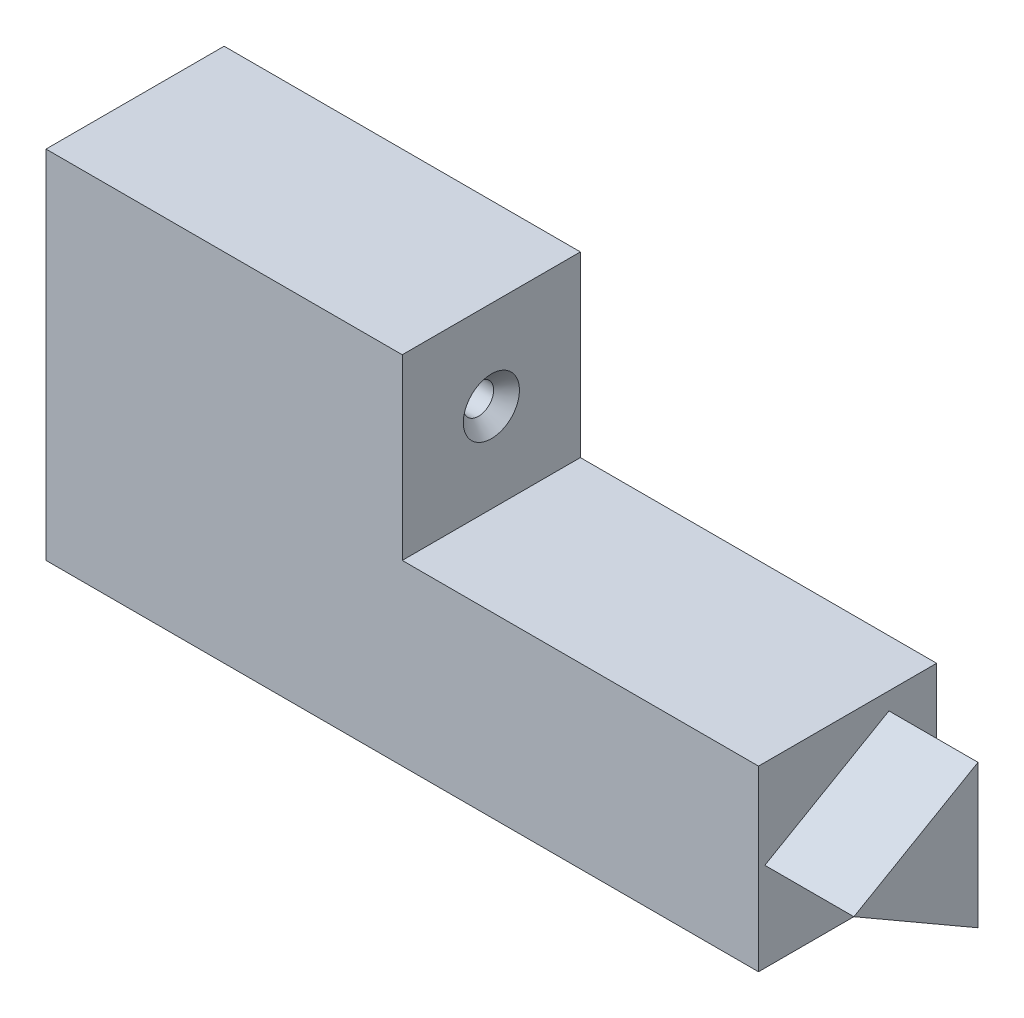
ISO-10303-21;
HEADER;
FILE_DESCRIPTION(('STEP AP214'),'2;1');
FILE_NAME('part.step','',(''),(''),'','','');
FILE_SCHEMA(('AUTOMOTIVE_DESIGN { 1 0 10303 214 1 1 1 1 }'));
ENDSEC;
DATA;
#1=APPLICATION_CONTEXT('core data for automotive mechanical design processes');
#2=APPLICATION_PROTOCOL_DEFINITION('international standard','automotive_design',2000,#1);
#3=PRODUCT_CONTEXT('',#1,'mechanical');
#4=PRODUCT('Part','Part','',(#3));
#5=PRODUCT_RELATED_PRODUCT_CATEGORY('part','',(#4));
#6=PRODUCT_DEFINITION_FORMATION('','',#4);
#7=PRODUCT_DEFINITION_CONTEXT('part definition',#1,'design');
#8=PRODUCT_DEFINITION('design','',#6,#7);
#9=PRODUCT_DEFINITION_SHAPE('','',#8);
#10=(LENGTH_UNIT() NAMED_UNIT(*) SI_UNIT(.MILLI.,.METRE.));
#11=(NAMED_UNIT(*) PLANE_ANGLE_UNIT() SI_UNIT($,.RADIAN.));
#12=(NAMED_UNIT(*) SI_UNIT($,.STERADIAN.) SOLID_ANGLE_UNIT());
#13=UNCERTAINTY_MEASURE_WITH_UNIT(LENGTH_MEASURE(1.E-05),#10,'distance_accuracy_value','');
#14=(GEOMETRIC_REPRESENTATION_CONTEXT(3) GLOBAL_UNCERTAINTY_ASSIGNED_CONTEXT((#13)) GLOBAL_UNIT_ASSIGNED_CONTEXT((#10,
#11,#12)) REPRESENTATION_CONTEXT('',''));
#15=CARTESIAN_POINT('',(0.,0.,0.));
#16=DIRECTION('',(0.,0.,1.));
#17=DIRECTION('',(1.,0.,0.));
#18=AXIS2_PLACEMENT_3D('',#15,#16,#17);
#19=CARTESIAN_POINT('',(80.,0.,0.));
#20=DIRECTION('',(-1.,0.,0.));
#21=DIRECTION('',(0.,0.,1.));
#22=AXIS2_PLACEMENT_3D('',#19,#20,#21);
#23=PLANE('',#22);
#24=DIRECTION('',(0.,-1.,0.));
#25=VECTOR('',#24,1.);
#26=CARTESIAN_POINT('',(80.,-17.6390114822675,37.7241266195551));
#27=LINE('',#26,#25);
#28=CARTESIAN_POINT('',(80.,2.36098851773249,37.7241266195551));
#29=VERTEX_POINT('',#28);
#30=CARTESIAN_POINT('',(80.,-17.6390114822675,37.7241266195551));
#31=VERTEX_POINT('',#30);
#32=EDGE_CURVE('E139',#29,#31,#27,.T.);
#33=ORIENTED_EDGE('',*,*,#32,.T.);
#34=DIRECTION('',(0.,0.,-1.));
#35=VECTOR('',#34,1.);
#36=CARTESIAN_POINT('',(80.,-17.6390114822675,37.7241266195551));
#37=LINE('',#36,#35);
#38=CARTESIAN_POINT('',(80.,-17.6390114822675,17.7241266195551));
#39=VERTEX_POINT('',#38);
#40=EDGE_CURVE('E142',#31,#39,#37,.T.);
#41=ORIENTED_EDGE('',*,*,#40,.T.);
#42=DIRECTION('',(0.,1.,0.));
#43=VECTOR('',#42,1.);
#44=CARTESIAN_POINT('',(80.,-17.6390114822675,17.7241266195551));
#45=LINE('',#44,#43);
#46=CARTESIAN_POINT('',(80.,2.36098851773249,17.7241266195551));
#47=VERTEX_POINT('',#46);
#48=EDGE_CURVE('E145',#39,#47,#45,.T.);
#49=ORIENTED_EDGE('',*,*,#48,.T.);
#50=DIRECTION('',(0.,0.,1.));
#51=VECTOR('',#50,1.);
#52=CARTESIAN_POINT('',(80.,2.36098851773249,37.7241266195551));
#53=LINE('',#52,#51);
#54=EDGE_CURVE('E147',#47,#29,#53,.T.);
#55=ORIENTED_EDGE('',*,*,#54,.T.);
#56=EDGE_LOOP('',(#33,#41,#49,#55));
#57=FACE_BOUND('',#56,.T.);
#58=DIRECTION('',(0.,-0.500000000000004,0.866025403784436));
#59=VECTOR('',#58,1.);
#60=CARTESIAN_POINT('',(80.,0.405430112207427,23.0796660995049));
#61=LINE('',#60,#59);
#62=CARTESIAN_POINT('',(80.,0.405430112207427,23.0796660995049));
#63=VERTEX_POINT('',#62);
#64=CARTESIAN_POINT('',(80.,-7.6390114822675,37.0130476596557));
#65=VERTEX_POINT('',#64);
#66=EDGE_CURVE('E123',#63,#65,#61,.T.);
#67=ORIENTED_EDGE('',*,*,#66,.F.);
#68=DIRECTION('',(0.,1.,0.));
#69=VECTOR('',#68,1.);
#70=CARTESIAN_POINT('',(80.,-15.6834530767424,23.0796660995048));
#71=LINE('',#70,#69);
#72=CARTESIAN_POINT('',(80.,-15.6834530767424,23.0796660995048));
#73=VERTEX_POINT('',#72);
#74=EDGE_CURVE('E54',#73,#63,#71,.T.);
#75=ORIENTED_EDGE('',*,*,#74,.F.);
#76=DIRECTION('',(0.,-0.499999999999998,-0.86602540378444));
#77=VECTOR('',#76,1.);
#78=CARTESIAN_POINT('',(80.,-7.63901148226751,37.0130476596557));
#79=LINE('',#78,#77);
#80=EDGE_CURVE('E50',#65,#73,#79,.T.);
#81=ORIENTED_EDGE('',*,*,#80,.F.);
#82=EDGE_LOOP('',(#67,#75,#81));
#83=FACE_BOUND('',#82,.T.);
#84=ADVANCED_FACE('F35',(#57,#83),#23,.F.);
#85=CARTESIAN_POINT('',(40.,0.,0.));
#86=DIRECTION('',(-1.,0.,0.));
#87=DIRECTION('',(0.,0.,1.));
#88=AXIS2_PLACEMENT_3D('',#85,#86,#87);
#89=PLANE('',#88);
#90=CARTESIAN_POINT('',(40.,12.3440984242791,27.7179331566266));
#91=DIRECTION('',(1.,0.,0.));
#92=DIRECTION('',(0.,0.,-1.));
#93=AXIS2_PLACEMENT_3D('',#90,#91,#92);
#94=CIRCLE('',#93,3.15);
#95=CARTESIAN_POINT('',(40.,12.3440984242791,24.5679331566266));
#96=VERTEX_POINT('',#95);
#97=EDGE_CURVE('E124',#96,#96,#94,.T.);
#98=ORIENTED_EDGE('',*,*,#97,.F.);
#99=EDGE_LOOP('',(#98));
#100=FACE_BOUND('',#99,.T.);
#101=DIRECTION('',(0.,0.,1.));
#102=VECTOR('',#101,1.);
#103=CARTESIAN_POINT('',(40.,2.36098851773249,37.7241266195551));
#104=LINE('',#103,#102);
#105=CARTESIAN_POINT('',(40.,2.36098851773249,17.7241266195551));
#106=VERTEX_POINT('',#105);
#107=CARTESIAN_POINT('',(40.,2.36098851773249,37.7241266195551));
#108=VERTEX_POINT('',#107);
#109=EDGE_CURVE('E138',#106,#108,#104,.T.);
#110=ORIENTED_EDGE('',*,*,#109,.F.);
#111=DIRECTION('',(0.,1.,0.));
#112=VECTOR('',#111,1.);
#113=CARTESIAN_POINT('',(40.,-17.6390114822675,17.7241266195551));
#114=LINE('',#113,#112);
#115=CARTESIAN_POINT('',(40.,22.3609885177325,17.7241266195551));
#116=VERTEX_POINT('',#115);
#117=EDGE_CURVE('E160',#106,#116,#114,.T.);
#118=ORIENTED_EDGE('',*,*,#117,.T.);
#119=DIRECTION('',(0.,0.,1.));
#120=VECTOR('',#119,1.);
#121=CARTESIAN_POINT('',(40.,22.3609885177325,37.7241266195551));
#122=LINE('',#121,#120);
#123=CARTESIAN_POINT('',(40.,22.3609885177325,37.7241266195551));
#124=VERTEX_POINT('',#123);
#125=EDGE_CURVE('E163',#116,#124,#122,.T.);
#126=ORIENTED_EDGE('',*,*,#125,.T.);
#127=DIRECTION('',(0.,-1.,0.));
#128=VECTOR('',#127,1.);
#129=CARTESIAN_POINT('',(40.,-17.6390114822675,37.7241266195551));
#130=LINE('',#129,#128);
#131=EDGE_CURVE('E158',#124,#108,#130,.T.);
#132=ORIENTED_EDGE('',*,*,#131,.T.);
#133=EDGE_LOOP('',(#110,#118,#126,#132));
#134=FACE_BOUND('',#133,.T.);
#135=ADVANCED_FACE('F199',(#100,#134),#89,.F.);
#136=CARTESIAN_POINT('',(40.,-17.6390114822675,37.7241266195551));
#137=DIRECTION('',(0.,0.,-1.));
#138=DIRECTION('',(-1.,0.,0.));
#139=AXIS2_PLACEMENT_3D('',#136,#137,#138);
#140=PLANE('',#139);
#141=DIRECTION('',(0.,-1.,0.));
#142=VECTOR('',#141,1.);
#143=CARTESIAN_POINT('',(0.,-17.6390114822675,37.7241266195551));
#144=LINE('',#143,#142);
#145=CARTESIAN_POINT('',(0.,22.3609885177325,37.7241266195551));
#146=VERTEX_POINT('',#145);
#147=CARTESIAN_POINT('',(0.,-17.6390114822675,37.7241266195551));
#148=VERTEX_POINT('',#147);
#149=EDGE_CURVE('E157',#146,#148,#144,.T.);
#150=ORIENTED_EDGE('',*,*,#149,.T.);
#151=DIRECTION('',(-1.,0.,0.));
#152=VECTOR('',#151,1.);
#153=CARTESIAN_POINT('',(40.,-17.6390114822675,37.7241266195551));
#154=LINE('',#153,#152);
#155=EDGE_CURVE('E11',#31,#148,#154,.T.);
#156=ORIENTED_EDGE('',*,*,#155,.F.);
#157=ORIENTED_EDGE('',*,*,#32,.F.);
#158=DIRECTION('',(-1.,0.,0.));
#159=VECTOR('',#158,1.);
#160=CARTESIAN_POINT('',(80.,2.36098851773249,37.7241266195551));
#161=LINE('',#160,#159);
#162=EDGE_CURVE('E149',#29,#108,#161,.T.);
#163=ORIENTED_EDGE('',*,*,#162,.T.);
#164=ORIENTED_EDGE('',*,*,#131,.F.);
#165=DIRECTION('',(-1.,0.,0.));
#166=VECTOR('',#165,1.);
#167=CARTESIAN_POINT('',(40.,22.3609885177325,37.7241266195551));
#168=LINE('',#167,#166);
#169=EDGE_CURVE('E165',#124,#146,#168,.T.);
#170=ORIENTED_EDGE('',*,*,#169,.T.);
#171=EDGE_LOOP('',(#150,#156,#157,#163,#164,#170));
#172=FACE_BOUND('',#171,.T.);
#173=ADVANCED_FACE('F37',(#172),#140,.F.);
#174=CARTESIAN_POINT('',(40.,-17.6390114822675,37.7241266195551));
#175=DIRECTION('',(0.,1.,0.));
#176=DIRECTION('',(0.,0.,1.));
#177=AXIS2_PLACEMENT_3D('',#174,#175,#176);
#178=PLANE('',#177);
#179=DIRECTION('',(0.,0.,-1.));
#180=VECTOR('',#179,1.);
#181=CARTESIAN_POINT('',(0.,-17.6390114822675,37.7241266195551));
#182=LINE('',#181,#180);
#183=CARTESIAN_POINT('',(0.,-17.6390114822675,17.7241266195551));
#184=VERTEX_POINT('',#183);
#185=EDGE_CURVE('E168',#148,#184,#182,.T.);
#186=ORIENTED_EDGE('',*,*,#185,.T.);
#187=DIRECTION('',(-1.,0.,0.));
#188=VECTOR('',#187,1.);
#189=CARTESIAN_POINT('',(40.,-17.6390114822675,17.7241266195551));
#190=LINE('',#189,#188);
#191=EDGE_CURVE('E43',#39,#184,#190,.T.);
#192=ORIENTED_EDGE('',*,*,#191,.F.);
#193=ORIENTED_EDGE('',*,*,#40,.F.);
#194=ORIENTED_EDGE('',*,*,#155,.T.);
#195=EDGE_LOOP('',(#186,#192,#193,#194));
#196=FACE_BOUND('',#195,.T.);
#197=ADVANCED_FACE('F205',(#196),#178,.F.);
#198=CARTESIAN_POINT('',(40.,-17.6390114822675,17.7241266195551));
#199=DIRECTION('',(0.,0.,1.));
#200=DIRECTION('',(1.,0.,0.));
#201=AXIS2_PLACEMENT_3D('',#198,#199,#200);
#202=PLANE('',#201);
#203=DIRECTION('',(0.,1.,0.));
#204=VECTOR('',#203,1.);
#205=CARTESIAN_POINT('',(0.,-17.6390114822675,17.7241266195551));
#206=LINE('',#205,#204);
#207=CARTESIAN_POINT('',(0.,22.3609885177325,17.7241266195551));
#208=VERTEX_POINT('',#207);
#209=EDGE_CURVE('E170',#184,#208,#206,.T.);
#210=ORIENTED_EDGE('',*,*,#209,.T.);
#211=DIRECTION('',(-1.,0.,0.));
#212=VECTOR('',#211,1.);
#213=CARTESIAN_POINT('',(40.,22.3609885177325,17.7241266195551));
#214=LINE('',#213,#212);
#215=EDGE_CURVE('E175',#116,#208,#214,.T.);
#216=ORIENTED_EDGE('',*,*,#215,.F.);
#217=ORIENTED_EDGE('',*,*,#117,.F.);
#218=DIRECTION('',(-1.,0.,0.));
#219=VECTOR('',#218,1.);
#220=CARTESIAN_POINT('',(80.,2.36098851773249,17.7241266195551));
#221=LINE('',#220,#219);
#222=EDGE_CURVE('E154',#47,#106,#221,.T.);
#223=ORIENTED_EDGE('',*,*,#222,.F.);
#224=ORIENTED_EDGE('',*,*,#48,.F.);
#225=ORIENTED_EDGE('',*,*,#191,.T.);
#226=EDGE_LOOP('',(#210,#216,#217,#223,#224,#225));
#227=FACE_BOUND('',#226,.T.);
#228=ADVANCED_FACE('F181',(#227),#202,.F.);
#229=CARTESIAN_POINT('',(40.,22.3609885177325,37.7241266195551));
#230=DIRECTION('',(0.,-1.,0.));
#231=DIRECTION('',(0.,0.,-1.));
#232=AXIS2_PLACEMENT_3D('',#229,#230,#231);
#233=PLANE('',#232);
#234=DIRECTION('',(0.,0.,1.));
#235=VECTOR('',#234,1.);
#236=CARTESIAN_POINT('',(0.,22.3609885177325,37.7241266195551));
#237=LINE('',#236,#235);
#238=EDGE_CURVE('E161',#208,#146,#237,.T.);
#239=ORIENTED_EDGE('',*,*,#238,.T.);
#240=ORIENTED_EDGE('',*,*,#169,.F.);
#241=ORIENTED_EDGE('',*,*,#125,.F.);
#242=ORIENTED_EDGE('',*,*,#215,.T.);
#243=EDGE_LOOP('',(#239,#240,#241,#242));
#244=FACE_BOUND('',#243,.T.);
#245=ADVANCED_FACE('F192',(#244),#233,.F.);
#246=CARTESIAN_POINT('',(0.,0.,0.));
#247=DIRECTION('',(-1.,0.,0.));
#248=DIRECTION('',(0.,0.,1.));
#249=AXIS2_PLACEMENT_3D('',#246,#247,#248);
#250=PLANE('',#249);
#251=CARTESIAN_POINT('',(0.,12.3440984242791,27.7179331566266));
#252=DIRECTION('',(1.,0.,0.));
#253=DIRECTION('',(0.,0.,-1.));
#254=AXIS2_PLACEMENT_3D('',#251,#252,#253);
#255=CIRCLE('',#254,1.69999999999998);
#256=CARTESIAN_POINT('',(0.,12.3440984242791,26.0179331566266));
#257=VERTEX_POINT('',#256);
#258=EDGE_CURVE('E135',#257,#257,#255,.T.);
#259=ORIENTED_EDGE('',*,*,#258,.T.);
#260=EDGE_LOOP('',(#259));
#261=FACE_BOUND('',#260,.T.);
#262=ORIENTED_EDGE('',*,*,#149,.F.);
#263=ORIENTED_EDGE('',*,*,#238,.F.);
#264=ORIENTED_EDGE('',*,*,#209,.F.);
#265=ORIENTED_EDGE('',*,*,#185,.F.);
#266=EDGE_LOOP('',(#262,#263,#264,#265));
#267=FACE_BOUND('',#266,.T.);
#268=ADVANCED_FACE('F189',(#261,#267),#250,.T.);
#269=CARTESIAN_POINT('',(80.,2.36098851773249,37.7241266195551));
#270=DIRECTION('',(0.,-1.,0.));
#271=DIRECTION('',(0.,0.,-1.));
#272=AXIS2_PLACEMENT_3D('',#269,#270,#271);
#273=PLANE('',#272);
#274=ORIENTED_EDGE('',*,*,#109,.T.);
#275=ORIENTED_EDGE('',*,*,#162,.F.);
#276=ORIENTED_EDGE('',*,*,#54,.F.);
#277=ORIENTED_EDGE('',*,*,#222,.T.);
#278=EDGE_LOOP('',(#274,#275,#276,#277));
#279=FACE_BOUND('',#278,.T.);
#280=ADVANCED_FACE('F202',(#279),#273,.F.);
#281=CARTESIAN_POINT('',(40.,12.3440984242791,27.7179331566266));
#282=DIRECTION('',(1.,0.,0.));
#283=DIRECTION('',(0.,0.,-1.));
#284=AXIS2_PLACEMENT_3D('',#281,#282,#283);
#285=CYLINDRICAL_SURFACE('',#284,1.69999999999999);
#286=ORIENTED_EDGE('',*,*,#258,.F.);
#287=EDGE_LOOP('',(#286));
#288=FACE_BOUND('',#287,.T.);
#289=CARTESIAN_POINT('',(38.55,12.3440984242791,27.7179331566266));
#290=DIRECTION('',(1.,0.,0.));
#291=DIRECTION('',(0.,0.,-1.));
#292=AXIS2_PLACEMENT_3D('',#289,#290,#291);
#293=CIRCLE('',#292,1.69999999999999);
#294=CARTESIAN_POINT('',(38.55,12.3440984242791,26.0179331566266));
#295=VERTEX_POINT('',#294);
#296=EDGE_CURVE('E127',#295,#295,#293,.T.);
#297=ORIENTED_EDGE('',*,*,#296,.T.);
#298=EDGE_LOOP('',(#297));
#299=FACE_BOUND('',#298,.T.);
#300=ADVANCED_FACE('F221',(#288,#299),#285,.F.);
#301=CARTESIAN_POINT('',(40.,12.3440984242791,27.7179331566266));
#302=DIRECTION('',(1.,0.,0.));
#303=DIRECTION('',(0.,0.,-1.));
#304=AXIS2_PLACEMENT_3D('',#301,#302,#303);
#305=CONICAL_SURFACE('',#304,3.15,0.785398163397448);
#306=ORIENTED_EDGE('',*,*,#296,.F.);
#307=EDGE_LOOP('',(#306));
#308=FACE_BOUND('',#307,.T.);
#309=ORIENTED_EDGE('',*,*,#97,.T.);
#310=EDGE_LOOP('',(#309));
#311=FACE_BOUND('',#310,.T.);
#312=ADVANCED_FACE('F249',(#308,#311),#305,.F.);
#313=CARTESIAN_POINT('',(90.,0.405430112207427,23.0796660995049));
#314=DIRECTION('',(0.,-0.866025403784436,-0.500000000000004));
#315=DIRECTION('',(0.,0.500000000000004,-0.866025403784436));
#316=AXIS2_PLACEMENT_3D('',#313,#314,#315);
#317=PLANE('',#316);
#318=ORIENTED_EDGE('',*,*,#66,.T.);
#319=DIRECTION('',(-1.,0.,0.));
#320=VECTOR('',#319,1.);
#321=CARTESIAN_POINT('',(90.,-7.63901148226751,37.0130476596557));
#322=LINE('',#321,#320);
#323=CARTESIAN_POINT('',(90.,-7.63901148226751,37.0130476596557));
#324=VERTEX_POINT('',#323);
#325=EDGE_CURVE('E107',#324,#65,#322,.T.);
#326=ORIENTED_EDGE('',*,*,#325,.F.);
#327=DIRECTION('',(0.,-0.500000000000004,0.866025403784436));
#328=VECTOR('',#327,1.);
#329=CARTESIAN_POINT('',(90.,0.405430112207427,23.0796660995049));
#330=LINE('',#329,#328);
#331=CARTESIAN_POINT('',(90.,0.405430112207427,23.0796660995049));
#332=VERTEX_POINT('',#331);
#333=EDGE_CURVE('E114',#332,#324,#330,.T.);
#334=ORIENTED_EDGE('',*,*,#333,.F.);
#335=DIRECTION('',(-1.,0.,0.));
#336=VECTOR('',#335,1.);
#337=CARTESIAN_POINT('',(90.,0.405430112207427,23.0796660995049));
#338=LINE('',#337,#336);
#339=EDGE_CURVE('E129',#332,#63,#338,.T.);
#340=ORIENTED_EDGE('',*,*,#339,.T.);
#341=EDGE_LOOP('',(#318,#326,#334,#340));
#342=FACE_BOUND('',#341,.T.);
#343=ADVANCED_FACE('F122',(#342),#317,.F.);
#344=CARTESIAN_POINT('',(90.,-7.63901148226751,37.0130476596557));
#345=DIRECTION('',(0.,0.86602540378444,-0.499999999999998));
#346=DIRECTION('',(0.,0.499999999999998,0.86602540378444));
#347=AXIS2_PLACEMENT_3D('',#344,#345,#346);
#348=PLANE('',#347);
#349=ORIENTED_EDGE('',*,*,#80,.T.);
#350=DIRECTION('',(-1.,0.,0.));
#351=VECTOR('',#350,1.);
#352=CARTESIAN_POINT('',(90.,-15.6834530767424,23.0796660995048));
#353=LINE('',#352,#351);
#354=CARTESIAN_POINT('',(90.,-15.6834530767424,23.0796660995048));
#355=VERTEX_POINT('',#354);
#356=EDGE_CURVE('E110',#355,#73,#353,.T.);
#357=ORIENTED_EDGE('',*,*,#356,.F.);
#358=DIRECTION('',(0.,-0.499999999999998,-0.86602540378444));
#359=VECTOR('',#358,1.);
#360=CARTESIAN_POINT('',(90.,-7.63901148226751,37.0130476596557));
#361=LINE('',#360,#359);
#362=EDGE_CURVE('E103',#324,#355,#361,.T.);
#363=ORIENTED_EDGE('',*,*,#362,.F.);
#364=ORIENTED_EDGE('',*,*,#325,.T.);
#365=EDGE_LOOP('',(#349,#357,#363,#364));
#366=FACE_BOUND('',#365,.T.);
#367=ADVANCED_FACE('F105',(#366),#348,.F.);
#368=CARTESIAN_POINT('',(90.,-15.6834530767424,23.0796660995048));
#369=DIRECTION('',(0.,0.,1.));
#370=DIRECTION('',(0.,-1.,0.));
#371=AXIS2_PLACEMENT_3D('',#368,#369,#370);
#372=PLANE('',#371);
#373=ORIENTED_EDGE('',*,*,#74,.T.);
#374=ORIENTED_EDGE('',*,*,#339,.F.);
#375=DIRECTION('',(0.,1.,0.));
#376=VECTOR('',#375,1.);
#377=CARTESIAN_POINT('',(90.,-15.6834530767424,23.0796660995048));
#378=LINE('',#377,#376);
#379=EDGE_CURVE('E113',#355,#332,#378,.T.);
#380=ORIENTED_EDGE('',*,*,#379,.F.);
#381=ORIENTED_EDGE('',*,*,#356,.T.);
#382=EDGE_LOOP('',(#373,#374,#380,#381));
#383=FACE_BOUND('',#382,.T.);
#384=ADVANCED_FACE('F268',(#383),#372,.F.);
#385=CARTESIAN_POINT('',(90.,0.,0.));
#386=DIRECTION('',(1.,0.,0.));
#387=DIRECTION('',(0.,0.,-1.));
#388=AXIS2_PLACEMENT_3D('',#385,#386,#387);
#389=PLANE('',#388);
#390=ORIENTED_EDGE('',*,*,#333,.T.);
#391=ORIENTED_EDGE('',*,*,#362,.T.);
#392=ORIENTED_EDGE('',*,*,#379,.T.);
#393=EDGE_LOOP('',(#390,#391,#392));
#394=FACE_BOUND('',#393,.T.);
#395=ADVANCED_FACE('F117',(#394),#389,.T.);
#396=CLOSED_SHELL('',(#84,#135,#173,#197,#228,#245,#268,#280,#300,#312,#343,#367,#384,#395));
#397=MANIFOLD_SOLID_BREP('B2',#396);
#398=ADVANCED_BREP_SHAPE_REPRESENTATION('',(#18,#397),#14);
#399=SHAPE_DEFINITION_REPRESENTATION(#9,#398);
ENDSEC;
END-ISO-10303-21;
